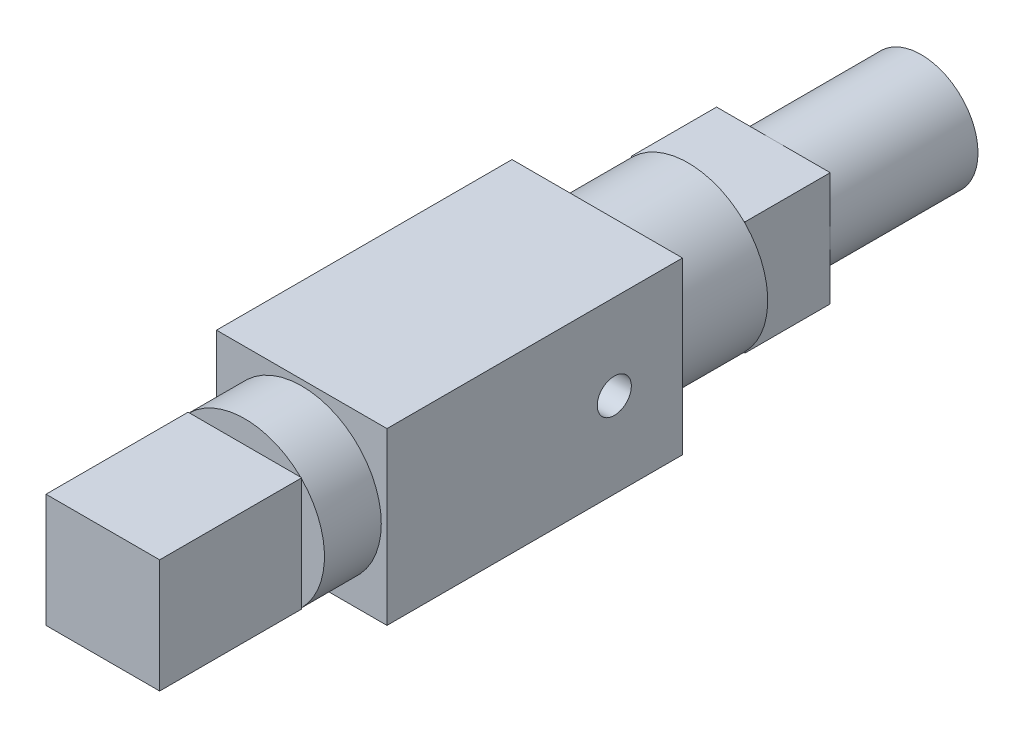
ISO-10303-21;
HEADER;
FILE_DESCRIPTION(('STEP AP214'),'2;1');
FILE_NAME('part.step','',(''),(''),'','','');
FILE_SCHEMA(('AUTOMOTIVE_DESIGN { 1 0 10303 214 1 1 1 1 }'));
ENDSEC;
DATA;
#1=APPLICATION_CONTEXT('core data for automotive mechanical design processes');
#2=APPLICATION_PROTOCOL_DEFINITION('international standard','automotive_design',2000,#1);
#3=PRODUCT_CONTEXT('',#1,'mechanical');
#4=PRODUCT('Part','Part','',(#3));
#5=PRODUCT_RELATED_PRODUCT_CATEGORY('part','',(#4));
#6=PRODUCT_DEFINITION_FORMATION('','',#4);
#7=PRODUCT_DEFINITION_CONTEXT('part definition',#1,'design');
#8=PRODUCT_DEFINITION('design','',#6,#7);
#9=PRODUCT_DEFINITION_SHAPE('','',#8);
#10=(LENGTH_UNIT() NAMED_UNIT(*) SI_UNIT(.MILLI.,.METRE.));
#11=(NAMED_UNIT(*) PLANE_ANGLE_UNIT() SI_UNIT($,.RADIAN.));
#12=(NAMED_UNIT(*) SI_UNIT($,.STERADIAN.) SOLID_ANGLE_UNIT());
#13=UNCERTAINTY_MEASURE_WITH_UNIT(LENGTH_MEASURE(1.E-05),#10,'distance_accuracy_value','');
#14=(GEOMETRIC_REPRESENTATION_CONTEXT(3) GLOBAL_UNCERTAINTY_ASSIGNED_CONTEXT((#13)) GLOBAL_UNIT_ASSIGNED_CONTEXT((#10,
#11,#12)) REPRESENTATION_CONTEXT('',''));
#15=CARTESIAN_POINT('',(0.,0.,0.));
#16=DIRECTION('',(0.,0.,1.));
#17=DIRECTION('',(1.,0.,0.));
#18=AXIS2_PLACEMENT_3D('',#15,#16,#17);
#19=CARTESIAN_POINT('',(0.,0.,59.5));
#20=DIRECTION('',(0.,0.,1.));
#21=DIRECTION('',(1.,0.,0.));
#22=AXIS2_PLACEMENT_3D('',#19,#20,#21);
#23=PLANE('',#22);
#24=DIRECTION('',(0.,-1.,0.));
#25=VECTOR('',#24,1.);
#26=CARTESIAN_POINT('',(-5.,-5.,59.5));
#27=LINE('',#26,#25);
#28=CARTESIAN_POINT('',(-5.,4.89897948556636,59.5));
#29=VERTEX_POINT('',#28);
#30=CARTESIAN_POINT('',(-5.,-4.89897948556636,59.5));
#31=VERTEX_POINT('',#30);
#32=EDGE_CURVE('E11',#29,#31,#27,.T.);
#33=ORIENTED_EDGE('',*,*,#32,.F.);
#34=CARTESIAN_POINT('',(0.,0.,59.5));
#35=DIRECTION('',(0.,0.,1.));
#36=DIRECTION('',(1.,0.,0.));
#37=AXIS2_PLACEMENT_3D('',#34,#35,#36);
#38=CIRCLE('',#37,7.);
#39=EDGE_CURVE('E737',#29,#31,#38,.T.);
#40=ORIENTED_EDGE('',*,*,#39,.T.);
#41=EDGE_LOOP('',(#33,#40));
#42=FACE_BOUND('',#41,.T.);
#43=ADVANCED_FACE('F38',(#42),#23,.T.);
#44=DIRECTION('',(-1.,0.,0.));
#45=VECTOR('',#44,1.);
#46=CARTESIAN_POINT('',(5.,5.,59.5));
#47=LINE('',#46,#45);
#48=CARTESIAN_POINT('',(4.89897948556636,5.,59.5));
#49=VERTEX_POINT('',#48);
#50=CARTESIAN_POINT('',(-4.89897948556636,5.,59.5));
#51=VERTEX_POINT('',#50);
#52=EDGE_CURVE('E47',#49,#51,#47,.T.);
#53=ORIENTED_EDGE('',*,*,#52,.F.);
#54=EDGE_CURVE('E228',#49,#51,#38,.T.);
#55=ORIENTED_EDGE('',*,*,#54,.T.);
#56=EDGE_LOOP('',(#53,#55));
#57=FACE_BOUND('',#56,.T.);
#58=ADVANCED_FACE('F351',(#57),#23,.T.);
#59=DIRECTION('',(0.,1.,0.));
#60=VECTOR('',#59,1.);
#61=CARTESIAN_POINT('',(5.,-5.,59.5));
#62=LINE('',#61,#60);
#63=CARTESIAN_POINT('',(5.,-4.89897948556636,59.5));
#64=VERTEX_POINT('',#63);
#65=CARTESIAN_POINT('',(5.,4.89897948556636,59.5));
#66=VERTEX_POINT('',#65);
#67=EDGE_CURVE('E56',#64,#66,#62,.T.);
#68=ORIENTED_EDGE('',*,*,#67,.F.);
#69=EDGE_CURVE('E217',#64,#66,#38,.T.);
#70=ORIENTED_EDGE('',*,*,#69,.T.);
#71=EDGE_LOOP('',(#68,#70));
#72=FACE_BOUND('',#71,.T.);
#73=ADVANCED_FACE('F358',(#72),#23,.T.);
#74=CARTESIAN_POINT('',(0.,0.,20.5));
#75=DIRECTION('',(0.,0.,1.));
#76=DIRECTION('',(1.,0.,0.));
#77=AXIS2_PLACEMENT_3D('',#74,#75,#76);
#78=PLANE('',#77);
#79=CARTESIAN_POINT('',(0.,0.,20.5));
#80=DIRECTION('',(0.,0.,1.));
#81=DIRECTION('',(1.,0.,0.));
#82=AXIS2_PLACEMENT_3D('',#79,#80,#81);
#83=CIRCLE('',#82,7.);
#84=CARTESIAN_POINT('',(5.,4.89897948556636,20.5));
#85=VERTEX_POINT('',#84);
#86=CARTESIAN_POINT('',(4.89897948556636,5.,20.5));
#87=VERTEX_POINT('',#86);
#88=EDGE_CURVE('E267',#85,#87,#83,.T.);
#89=ORIENTED_EDGE('',*,*,#88,.F.);
#90=DIRECTION('',(0.,1.,0.));
#91=VECTOR('',#90,1.);
#92=CARTESIAN_POINT('',(5.,-5.,20.5));
#93=LINE('',#92,#91);
#94=CARTESIAN_POINT('',(5.,5.,20.5));
#95=VERTEX_POINT('',#94);
#96=EDGE_CURVE('E281',#85,#95,#93,.T.);
#97=ORIENTED_EDGE('',*,*,#96,.T.);
#98=DIRECTION('',(-1.,0.,0.));
#99=VECTOR('',#98,1.);
#100=CARTESIAN_POINT('',(5.,5.,20.5));
#101=LINE('',#100,#99);
#102=EDGE_CURVE('E287',#95,#87,#101,.T.);
#103=ORIENTED_EDGE('',*,*,#102,.T.);
#104=EDGE_LOOP('',(#89,#97,#103));
#105=FACE_BOUND('',#104,.T.);
#106=ADVANCED_FACE('F376',(#105),#78,.T.);
#107=CARTESIAN_POINT('',(-4.89897948556636,5.,20.5));
#108=VERTEX_POINT('',#107);
#109=CARTESIAN_POINT('',(-5.,4.89897948556636,20.5));
#110=VERTEX_POINT('',#109);
#111=EDGE_CURVE('E232',#108,#110,#83,.T.);
#112=ORIENTED_EDGE('',*,*,#111,.F.);
#113=CARTESIAN_POINT('',(-5.,5.,20.5));
#114=VERTEX_POINT('',#113);
#115=EDGE_CURVE('E285',#108,#114,#101,.T.);
#116=ORIENTED_EDGE('',*,*,#115,.T.);
#117=DIRECTION('',(0.,-1.,0.));
#118=VECTOR('',#117,1.);
#119=CARTESIAN_POINT('',(-5.,-5.,20.5));
#120=LINE('',#119,#118);
#121=EDGE_CURVE('E272',#114,#110,#120,.T.);
#122=ORIENTED_EDGE('',*,*,#121,.T.);
#123=EDGE_LOOP('',(#112,#116,#122));
#124=FACE_BOUND('',#123,.T.);
#125=ADVANCED_FACE('F380',(#124),#78,.T.);
#126=CARTESIAN_POINT('',(-5.,-4.89897948556636,20.5));
#127=VERTEX_POINT('',#126);
#128=CARTESIAN_POINT('',(-4.89897948556636,-5.,20.5));
#129=VERTEX_POINT('',#128);
#130=EDGE_CURVE('E326',#127,#129,#83,.T.);
#131=ORIENTED_EDGE('',*,*,#130,.F.);
#132=CARTESIAN_POINT('',(-5.,-5.,20.5));
#133=VERTEX_POINT('',#132);
#134=EDGE_CURVE('E277',#127,#133,#120,.T.);
#135=ORIENTED_EDGE('',*,*,#134,.T.);
#136=DIRECTION('',(1.,0.,0.));
#137=VECTOR('',#136,1.);
#138=CARTESIAN_POINT('',(5.,-5.,20.5));
#139=LINE('',#138,#137);
#140=EDGE_CURVE('E278',#133,#129,#139,.T.);
#141=ORIENTED_EDGE('',*,*,#140,.T.);
#142=EDGE_LOOP('',(#131,#135,#141));
#143=FACE_BOUND('',#142,.T.);
#144=ADVANCED_FACE('F348',(#143),#78,.T.);
#145=CARTESIAN_POINT('',(0.,0.,13.));
#146=DIRECTION('',(0.,0.,-1.));
#147=DIRECTION('',(-1.,0.,0.));
#148=AXIS2_PLACEMENT_3D('',#145,#146,#147);
#149=CYLINDRICAL_SURFACE('',#148,5.);
#150=CARTESIAN_POINT('',(0.,0.,13.));
#151=DIRECTION('',(0.,0.,1.));
#152=DIRECTION('',(1.,0.,0.));
#153=AXIS2_PLACEMENT_3D('',#150,#151,#152);
#154=CIRCLE('',#153,5.);
#155=CARTESIAN_POINT('',(5.,0.,13.));
#156=VERTEX_POINT('',#155);
#157=CARTESIAN_POINT('',(0.,5.,13.));
#158=VERTEX_POINT('',#157);
#159=EDGE_CURVE('E317',#156,#158,#154,.T.);
#160=ORIENTED_EDGE('',*,*,#159,.F.);
#161=CARTESIAN_POINT('',(0.,-5.,13.));
#162=VERTEX_POINT('',#161);
#163=EDGE_CURVE('E320',#162,#156,#154,.T.);
#164=ORIENTED_EDGE('',*,*,#163,.F.);
#165=CARTESIAN_POINT('',(-5.,0.,13.));
#166=VERTEX_POINT('',#165);
#167=EDGE_CURVE('E328',#166,#162,#154,.T.);
#168=ORIENTED_EDGE('',*,*,#167,.F.);
#169=EDGE_CURVE('E319',#158,#166,#154,.T.);
#170=ORIENTED_EDGE('',*,*,#169,.F.);
#171=EDGE_LOOP('',(#160,#164,#168,#170));
#172=FACE_BOUND('',#171,.T.);
#173=CARTESIAN_POINT('',(0.,0.,0.));
#174=DIRECTION('',(0.,0.,1.));
#175=DIRECTION('',(1.,0.,0.));
#176=AXIS2_PLACEMENT_3D('',#173,#174,#175);
#177=CIRCLE('',#176,5.);
#178=CARTESIAN_POINT('',(5.,0.,0.));
#179=VERTEX_POINT('',#178);
#180=EDGE_CURVE('E42',#179,#179,#177,.T.);
#181=ORIENTED_EDGE('',*,*,#180,.T.);
#182=EDGE_LOOP('',(#181));
#183=FACE_BOUND('',#182,.T.);
#184=ADVANCED_FACE('F337',(#172,#183),#149,.T.);
#185=CARTESIAN_POINT('',(0.,0.,8.96538461538461));
#186=DIRECTION('',(0.,0.,1.));
#187=DIRECTION('',(1.,0.,0.));
#188=AXIS2_PLACEMENT_3D('',#185,#186,#187);
#189=SPHERICAL_SURFACE('',#188,10.2653846153846);
#190=ORIENTED_EDGE('',*,*,#180,.F.);
#191=EDGE_LOOP('',(#190));
#192=FACE_BOUND('',#191,.T.);
#193=ADVANCED_FACE('F40',(#192),#189,.T.);
#194=CARTESIAN_POINT('',(0.,0.,13.));
#195=DIRECTION('',(0.,0.,1.));
#196=DIRECTION('',(1.,0.,0.));
#197=AXIS2_PLACEMENT_3D('',#194,#195,#196);
#198=PLANE('',#197);
#199=DIRECTION('',(0.,1.,0.));
#200=VECTOR('',#199,1.);
#201=CARTESIAN_POINT('',(5.,-5.,13.));
#202=LINE('',#201,#200);
#203=CARTESIAN_POINT('',(5.,5.,13.));
#204=VERTEX_POINT('',#203);
#205=EDGE_CURVE('E299',#156,#204,#202,.T.);
#206=ORIENTED_EDGE('',*,*,#205,.F.);
#207=ORIENTED_EDGE('',*,*,#159,.T.);
#208=DIRECTION('',(-1.,0.,0.));
#209=VECTOR('',#208,1.);
#210=CARTESIAN_POINT('',(5.,5.,13.));
#211=LINE('',#210,#209);
#212=EDGE_CURVE('E304',#204,#158,#211,.T.);
#213=ORIENTED_EDGE('',*,*,#212,.F.);
#214=EDGE_LOOP('',(#206,#207,#213));
#215=FACE_BOUND('',#214,.T.);
#216=ADVANCED_FACE('F340',(#215),#198,.F.);
#217=CARTESIAN_POINT('',(-5.,5.,13.));
#218=VERTEX_POINT('',#217);
#219=EDGE_CURVE('E303',#158,#218,#211,.T.);
#220=ORIENTED_EDGE('',*,*,#219,.F.);
#221=ORIENTED_EDGE('',*,*,#169,.T.);
#222=DIRECTION('',(0.,-1.,0.));
#223=VECTOR('',#222,1.);
#224=CARTESIAN_POINT('',(-5.,-5.,13.));
#225=LINE('',#224,#223);
#226=EDGE_CURVE('E292',#218,#166,#225,.T.);
#227=ORIENTED_EDGE('',*,*,#226,.F.);
#228=EDGE_LOOP('',(#220,#221,#227));
#229=FACE_BOUND('',#228,.T.);
#230=ADVANCED_FACE('F345',(#229),#198,.F.);
#231=CARTESIAN_POINT('',(-5.,-5.,13.));
#232=VERTEX_POINT('',#231);
#233=EDGE_CURVE('E266',#166,#232,#225,.T.);
#234=ORIENTED_EDGE('',*,*,#233,.F.);
#235=ORIENTED_EDGE('',*,*,#167,.T.);
#236=DIRECTION('',(1.,0.,0.));
#237=VECTOR('',#236,1.);
#238=CARTESIAN_POINT('',(5.,-5.,13.));
#239=LINE('',#238,#237);
#240=EDGE_CURVE('E296',#232,#162,#239,.T.);
#241=ORIENTED_EDGE('',*,*,#240,.F.);
#242=EDGE_LOOP('',(#234,#235,#241));
#243=FACE_BOUND('',#242,.T.);
#244=ADVANCED_FACE('F447',(#243),#198,.F.);
#245=CARTESIAN_POINT('',(5.,-5.,13.));
#246=VERTEX_POINT('',#245);
#247=EDGE_CURVE('E295',#162,#246,#239,.T.);
#248=ORIENTED_EDGE('',*,*,#247,.F.);
#249=ORIENTED_EDGE('',*,*,#163,.T.);
#250=EDGE_CURVE('E300',#246,#156,#202,.T.);
#251=ORIENTED_EDGE('',*,*,#250,.F.);
#252=EDGE_LOOP('',(#248,#249,#251));
#253=FACE_BOUND('',#252,.T.);
#254=ADVANCED_FACE('F347',(#253),#198,.F.);
#255=CARTESIAN_POINT('',(-5.,-5.,20.5));
#256=DIRECTION('',(1.,0.,0.));
#257=DIRECTION('',(0.,0.,-1.));
#258=AXIS2_PLACEMENT_3D('',#255,#256,#257);
#259=PLANE('',#258);
#260=ORIENTED_EDGE('',*,*,#226,.T.);
#261=ORIENTED_EDGE('',*,*,#233,.T.);
#262=DIRECTION('',(0.,0.,-1.));
#263=VECTOR('',#262,1.);
#264=CARTESIAN_POINT('',(-5.,-5.,20.5));
#265=LINE('',#264,#263);
#266=EDGE_CURVE('E315',#133,#232,#265,.T.);
#267=ORIENTED_EDGE('',*,*,#266,.F.);
#268=ORIENTED_EDGE('',*,*,#134,.F.);
#269=EDGE_CURVE('E276',#110,#127,#120,.T.);
#270=ORIENTED_EDGE('',*,*,#269,.F.);
#271=ORIENTED_EDGE('',*,*,#121,.F.);
#272=DIRECTION('',(0.,0.,-1.));
#273=VECTOR('',#272,1.);
#274=CARTESIAN_POINT('',(-5.,5.,20.5));
#275=LINE('',#274,#273);
#276=EDGE_CURVE('E290',#114,#218,#275,.T.);
#277=ORIENTED_EDGE('',*,*,#276,.T.);
#278=EDGE_LOOP('',(#260,#261,#267,#268,#270,#271,#277));
#279=FACE_BOUND('',#278,.T.);
#280=ADVANCED_FACE('F418',(#279),#259,.F.);
#281=CARTESIAN_POINT('',(5.,-5.,20.5));
#282=DIRECTION('',(0.,1.,0.));
#283=DIRECTION('',(-1.,0.,0.));
#284=AXIS2_PLACEMENT_3D('',#281,#282,#283);
#285=PLANE('',#284);
#286=ORIENTED_EDGE('',*,*,#240,.T.);
#287=ORIENTED_EDGE('',*,*,#247,.T.);
#288=DIRECTION('',(0.,0.,-1.));
#289=VECTOR('',#288,1.);
#290=CARTESIAN_POINT('',(5.,-5.,20.5));
#291=LINE('',#290,#289);
#292=CARTESIAN_POINT('',(5.,-5.,20.5));
#293=VERTEX_POINT('',#292);
#294=EDGE_CURVE('E312',#293,#246,#291,.T.);
#295=ORIENTED_EDGE('',*,*,#294,.F.);
#296=CARTESIAN_POINT('',(4.89897948556636,-5.,20.5));
#297=VERTEX_POINT('',#296);
#298=EDGE_CURVE('E275',#297,#293,#139,.T.);
#299=ORIENTED_EDGE('',*,*,#298,.F.);
#300=EDGE_CURVE('E282',#129,#297,#139,.T.);
#301=ORIENTED_EDGE('',*,*,#300,.F.);
#302=ORIENTED_EDGE('',*,*,#140,.F.);
#303=ORIENTED_EDGE('',*,*,#266,.T.);
#304=EDGE_LOOP('',(#286,#287,#295,#299,#301,#302,#303));
#305=FACE_BOUND('',#304,.T.);
#306=ADVANCED_FACE('F449',(#305),#285,.F.);
#307=CARTESIAN_POINT('',(5.,-5.,20.5));
#308=DIRECTION('',(-1.,0.,0.));
#309=DIRECTION('',(0.,0.,1.));
#310=AXIS2_PLACEMENT_3D('',#307,#308,#309);
#311=PLANE('',#310);
#312=ORIENTED_EDGE('',*,*,#250,.T.);
#313=ORIENTED_EDGE('',*,*,#205,.T.);
#314=DIRECTION('',(0.,0.,-1.));
#315=VECTOR('',#314,1.);
#316=CARTESIAN_POINT('',(5.,5.,20.5));
#317=LINE('',#316,#315);
#318=EDGE_CURVE('E309',#95,#204,#317,.T.);
#319=ORIENTED_EDGE('',*,*,#318,.F.);
#320=ORIENTED_EDGE('',*,*,#96,.F.);
#321=CARTESIAN_POINT('',(5.,-4.89897948556636,20.5));
#322=VERTEX_POINT('',#321);
#323=EDGE_CURVE('E286',#322,#85,#93,.T.);
#324=ORIENTED_EDGE('',*,*,#323,.F.);
#325=EDGE_CURVE('E283',#293,#322,#93,.T.);
#326=ORIENTED_EDGE('',*,*,#325,.F.);
#327=ORIENTED_EDGE('',*,*,#294,.T.);
#328=EDGE_LOOP('',(#312,#313,#319,#320,#324,#326,#327));
#329=FACE_BOUND('',#328,.T.);
#330=ADVANCED_FACE('F401',(#329),#311,.F.);
#331=CARTESIAN_POINT('',(5.,5.,20.5));
#332=DIRECTION('',(0.,-1.,0.));
#333=DIRECTION('',(1.,0.,0.));
#334=AXIS2_PLACEMENT_3D('',#331,#332,#333);
#335=PLANE('',#334);
#336=ORIENTED_EDGE('',*,*,#212,.T.);
#337=ORIENTED_EDGE('',*,*,#219,.T.);
#338=ORIENTED_EDGE('',*,*,#276,.F.);
#339=ORIENTED_EDGE('',*,*,#115,.F.);
#340=EDGE_CURVE('E291',#87,#108,#101,.T.);
#341=ORIENTED_EDGE('',*,*,#340,.F.);
#342=ORIENTED_EDGE('',*,*,#102,.F.);
#343=ORIENTED_EDGE('',*,*,#318,.T.);
#344=EDGE_LOOP('',(#336,#337,#338,#339,#341,#342,#343));
#345=FACE_BOUND('',#344,.T.);
#346=ADVANCED_FACE('F391',(#345),#335,.F.);
#347=EDGE_CURVE('E271',#297,#322,#83,.T.);
#348=ORIENTED_EDGE('',*,*,#347,.F.);
#349=ORIENTED_EDGE('',*,*,#298,.T.);
#350=ORIENTED_EDGE('',*,*,#325,.T.);
#351=EDGE_LOOP('',(#348,#349,#350));
#352=FACE_BOUND('',#351,.T.);
#353=ADVANCED_FACE('F383',(#352),#78,.T.);
#354=CARTESIAN_POINT('',(0.,0.,20.5));
#355=DIRECTION('',(0.,0.,1.));
#356=DIRECTION('',(1.,0.,0.));
#357=AXIS2_PLACEMENT_3D('',#354,#355,#356);
#358=PLANE('',#357);
#359=EDGE_CURVE('E421',#110,#127,#83,.T.);
#360=ORIENTED_EDGE('',*,*,#359,.F.);
#361=ORIENTED_EDGE('',*,*,#269,.T.);
#362=EDGE_LOOP('',(#360,#361));
#363=FACE_BOUND('',#362,.T.);
#364=ADVANCED_FACE('F390',(#363),#358,.F.);
#365=EDGE_CURVE('E425',#129,#297,#83,.T.);
#366=ORIENTED_EDGE('',*,*,#365,.F.);
#367=ORIENTED_EDGE('',*,*,#300,.T.);
#368=EDGE_LOOP('',(#366,#367));
#369=FACE_BOUND('',#368,.T.);
#370=ADVANCED_FACE('F397',(#369),#358,.F.);
#371=EDGE_CURVE('E262',#322,#85,#83,.T.);
#372=ORIENTED_EDGE('',*,*,#371,.F.);
#373=ORIENTED_EDGE('',*,*,#323,.T.);
#374=EDGE_LOOP('',(#372,#373));
#375=FACE_BOUND('',#374,.T.);
#376=ADVANCED_FACE('F430',(#375),#358,.F.);
#377=EDGE_CURVE('E270',#87,#108,#83,.T.);
#378=ORIENTED_EDGE('',*,*,#377,.F.);
#379=ORIENTED_EDGE('',*,*,#340,.T.);
#380=EDGE_LOOP('',(#378,#379));
#381=FACE_BOUND('',#380,.T.);
#382=ADVANCED_FACE('F400',(#381),#358,.F.);
#383=CARTESIAN_POINT('',(0.,0.,28.5));
#384=DIRECTION('',(0.,0.,-1.));
#385=DIRECTION('',(-1.,0.,0.));
#386=AXIS2_PLACEMENT_3D('',#383,#384,#385);
#387=CYLINDRICAL_SURFACE('',#386,7.);
#388=CARTESIAN_POINT('',(0.,0.,28.5));
#389=DIRECTION('',(0.,0.,1.));
#390=DIRECTION('',(1.,0.,0.));
#391=AXIS2_PLACEMENT_3D('',#388,#389,#390);
#392=CIRCLE('',#391,7.);
#393=CARTESIAN_POINT('',(7.,0.,28.5));
#394=VERTEX_POINT('',#393);
#395=EDGE_CURVE('E263',#394,#394,#392,.T.);
#396=ORIENTED_EDGE('',*,*,#395,.F.);
#397=EDGE_LOOP('',(#396));
#398=FACE_BOUND('',#397,.T.);
#399=ORIENTED_EDGE('',*,*,#88,.T.);
#400=ORIENTED_EDGE('',*,*,#377,.T.);
#401=ORIENTED_EDGE('',*,*,#111,.T.);
#402=ORIENTED_EDGE('',*,*,#359,.T.);
#403=ORIENTED_EDGE('',*,*,#130,.T.);
#404=ORIENTED_EDGE('',*,*,#365,.T.);
#405=ORIENTED_EDGE('',*,*,#347,.T.);
#406=ORIENTED_EDGE('',*,*,#371,.T.);
#407=EDGE_LOOP('',(#399,#400,#401,#402,#403,#404,#405,#406));
#408=FACE_BOUND('',#407,.T.);
#409=ADVANCED_FACE('F423',(#398,#408),#387,.T.);
#410=CARTESIAN_POINT('',(-7.5,-7.5,54.5));
#411=DIRECTION('',(1.,0.,0.));
#412=DIRECTION('',(0.,0.,-1.));
#413=AXIS2_PLACEMENT_3D('',#410,#411,#412);
#414=PLANE('',#413);
#415=CARTESIAN_POINT('',(-7.5,0.,34.5));
#416=DIRECTION('',(-1.,0.,0.));
#417=DIRECTION('',(0.,0.,1.));
#418=AXIS2_PLACEMENT_3D('',#415,#416,#417);
#419=CIRCLE('',#418,1.5);
#420=CARTESIAN_POINT('',(-7.5,0.,36.));
#421=VERTEX_POINT('',#420);
#422=EDGE_CURVE('E705',#421,#421,#419,.T.);
#423=ORIENTED_EDGE('',*,*,#422,.F.);
#424=EDGE_LOOP('',(#423));
#425=FACE_BOUND('',#424,.T.);
#426=DIRECTION('',(0.,-1.,0.));
#427=VECTOR('',#426,1.);
#428=CARTESIAN_POINT('',(-7.5,-7.5,28.5));
#429=LINE('',#428,#427);
#430=CARTESIAN_POINT('',(-7.5,7.5,28.5));
#431=VERTEX_POINT('',#430);
#432=CARTESIAN_POINT('',(-7.5,-7.5,28.5));
#433=VERTEX_POINT('',#432);
#434=EDGE_CURVE('E227',#431,#433,#429,.T.);
#435=ORIENTED_EDGE('',*,*,#434,.T.);
#436=DIRECTION('',(0.,0.,-1.));
#437=VECTOR('',#436,1.);
#438=CARTESIAN_POINT('',(-7.5,-7.5,54.5));
#439=LINE('',#438,#437);
#440=CARTESIAN_POINT('',(-7.5,-7.5,54.5));
#441=VERTEX_POINT('',#440);
#442=EDGE_CURVE('E259',#441,#433,#439,.T.);
#443=ORIENTED_EDGE('',*,*,#442,.F.);
#444=DIRECTION('',(0.,-1.,0.));
#445=VECTOR('',#444,1.);
#446=CARTESIAN_POINT('',(-7.5,-7.5,54.5));
#447=LINE('',#446,#445);
#448=CARTESIAN_POINT('',(-7.5,7.5,54.5));
#449=VERTEX_POINT('',#448);
#450=EDGE_CURVE('E233',#449,#441,#447,.T.);
#451=ORIENTED_EDGE('',*,*,#450,.F.);
#452=DIRECTION('',(0.,0.,-1.));
#453=VECTOR('',#452,1.);
#454=CARTESIAN_POINT('',(-7.5,7.5,54.5));
#455=LINE('',#454,#453);
#456=EDGE_CURVE('E243',#449,#431,#455,.T.);
#457=ORIENTED_EDGE('',*,*,#456,.T.);
#458=EDGE_LOOP('',(#435,#443,#451,#457));
#459=FACE_BOUND('',#458,.T.);
#460=ADVANCED_FACE('F518',(#425,#459),#414,.F.);
#461=CARTESIAN_POINT('',(7.5,-7.5,54.5));
#462=DIRECTION('',(0.,1.,0.));
#463=DIRECTION('',(-1.,0.,0.));
#464=AXIS2_PLACEMENT_3D('',#461,#462,#463);
#465=PLANE('',#464);
#466=DIRECTION('',(1.,0.,0.));
#467=VECTOR('',#466,1.);
#468=CARTESIAN_POINT('',(7.5,-7.5,28.5));
#469=LINE('',#468,#467);
#470=CARTESIAN_POINT('',(7.5,-7.5,28.5));
#471=VERTEX_POINT('',#470);
#472=EDGE_CURVE('E246',#433,#471,#469,.T.);
#473=ORIENTED_EDGE('',*,*,#472,.T.);
#474=DIRECTION('',(0.,0.,-1.));
#475=VECTOR('',#474,1.);
#476=CARTESIAN_POINT('',(7.5,-7.5,54.5));
#477=LINE('',#476,#475);
#478=CARTESIAN_POINT('',(7.5,-7.5,54.5));
#479=VERTEX_POINT('',#478);
#480=EDGE_CURVE('E256',#479,#471,#477,.T.);
#481=ORIENTED_EDGE('',*,*,#480,.F.);
#482=DIRECTION('',(1.,0.,0.));
#483=VECTOR('',#482,1.);
#484=CARTESIAN_POINT('',(7.5,-7.5,54.5));
#485=LINE('',#484,#483);
#486=EDGE_CURVE('E236',#441,#479,#485,.T.);
#487=ORIENTED_EDGE('',*,*,#486,.F.);
#488=ORIENTED_EDGE('',*,*,#442,.T.);
#489=EDGE_LOOP('',(#473,#481,#487,#488));
#490=FACE_BOUND('',#489,.T.);
#491=ADVANCED_FACE('F525',(#490),#465,.F.);
#492=CARTESIAN_POINT('',(7.5,-7.5,54.5));
#493=DIRECTION('',(-1.,0.,0.));
#494=DIRECTION('',(0.,-1.,0.));
#495=AXIS2_PLACEMENT_3D('',#492,#493,#494);
#496=PLANE('',#495);
#497=CARTESIAN_POINT('',(7.5,0.,34.5));
#498=DIRECTION('',(-1.,0.,0.));
#499=DIRECTION('',(0.,0.,1.));
#500=AXIS2_PLACEMENT_3D('',#497,#498,#499);
#501=CIRCLE('',#500,1.5);
#502=CARTESIAN_POINT('',(7.5,0.,36.));
#503=VERTEX_POINT('',#502);
#504=EDGE_CURVE('E702',#503,#503,#501,.T.);
#505=ORIENTED_EDGE('',*,*,#504,.T.);
#506=EDGE_LOOP('',(#505));
#507=FACE_BOUND('',#506,.T.);
#508=DIRECTION('',(0.,1.,0.));
#509=VECTOR('',#508,1.);
#510=CARTESIAN_POINT('',(7.5,-7.5,28.5));
#511=LINE('',#510,#509);
#512=CARTESIAN_POINT('',(7.5,7.5,28.5));
#513=VERTEX_POINT('',#512);
#514=EDGE_CURVE('E248',#471,#513,#511,.T.);
#515=ORIENTED_EDGE('',*,*,#514,.T.);
#516=DIRECTION('',(0.,0.,-1.));
#517=VECTOR('',#516,1.);
#518=CARTESIAN_POINT('',(7.5,7.5,54.5));
#519=LINE('',#518,#517);
#520=CARTESIAN_POINT('',(7.5,7.5,54.5));
#521=VERTEX_POINT('',#520);
#522=EDGE_CURVE('E253',#521,#513,#519,.T.);
#523=ORIENTED_EDGE('',*,*,#522,.F.);
#524=DIRECTION('',(0.,1.,0.));
#525=VECTOR('',#524,1.);
#526=CARTESIAN_POINT('',(7.5,-7.5,54.5));
#527=LINE('',#526,#525);
#528=EDGE_CURVE('E239',#479,#521,#527,.T.);
#529=ORIENTED_EDGE('',*,*,#528,.F.);
#530=ORIENTED_EDGE('',*,*,#480,.T.);
#531=EDGE_LOOP('',(#515,#523,#529,#530));
#532=FACE_BOUND('',#531,.T.);
#533=ADVANCED_FACE('F530',(#507,#532),#496,.F.);
#534=CARTESIAN_POINT('',(7.5,7.5,54.5));
#535=DIRECTION('',(0.,-1.,0.));
#536=DIRECTION('',(1.,0.,0.));
#537=AXIS2_PLACEMENT_3D('',#534,#535,#536);
#538=PLANE('',#537);
#539=DIRECTION('',(-1.,0.,0.));
#540=VECTOR('',#539,1.);
#541=CARTESIAN_POINT('',(7.5,7.5,28.5));
#542=LINE('',#541,#540);
#543=EDGE_CURVE('E237',#513,#431,#542,.T.);
#544=ORIENTED_EDGE('',*,*,#543,.T.);
#545=ORIENTED_EDGE('',*,*,#456,.F.);
#546=DIRECTION('',(-1.,0.,0.));
#547=VECTOR('',#546,1.);
#548=CARTESIAN_POINT('',(7.5,7.5,54.5));
#549=LINE('',#548,#547);
#550=EDGE_CURVE('E241',#521,#449,#549,.T.);
#551=ORIENTED_EDGE('',*,*,#550,.F.);
#552=ORIENTED_EDGE('',*,*,#522,.T.);
#553=EDGE_LOOP('',(#544,#545,#551,#552));
#554=FACE_BOUND('',#553,.T.);
#555=ADVANCED_FACE('F538',(#554),#538,.F.);
#556=CARTESIAN_POINT('',(0.,0.,54.5));
#557=DIRECTION('',(0.,0.,1.));
#558=DIRECTION('',(1.,0.,0.));
#559=AXIS2_PLACEMENT_3D('',#556,#557,#558);
#560=PLANE('',#559);
#561=CARTESIAN_POINT('',(0.,0.,54.5));
#562=DIRECTION('',(0.,0.,1.));
#563=DIRECTION('',(1.,0.,0.));
#564=AXIS2_PLACEMENT_3D('',#561,#562,#563);
#565=CIRCLE('',#564,7.);
#566=CARTESIAN_POINT('',(7.,0.,54.5));
#567=VERTEX_POINT('',#566);
#568=EDGE_CURVE('E229',#567,#567,#565,.T.);
#569=ORIENTED_EDGE('',*,*,#568,.F.);
#570=EDGE_LOOP('',(#569));
#571=FACE_BOUND('',#570,.T.);
#572=ORIENTED_EDGE('',*,*,#450,.T.);
#573=ORIENTED_EDGE('',*,*,#486,.T.);
#574=ORIENTED_EDGE('',*,*,#528,.T.);
#575=ORIENTED_EDGE('',*,*,#550,.T.);
#576=EDGE_LOOP('',(#572,#573,#574,#575));
#577=FACE_BOUND('',#576,.T.);
#578=ADVANCED_FACE('F543',(#571,#577),#560,.T.);
#579=CARTESIAN_POINT('',(0.,0.,28.5));
#580=DIRECTION('',(0.,0.,1.));
#581=DIRECTION('',(1.,0.,0.));
#582=AXIS2_PLACEMENT_3D('',#579,#580,#581);
#583=PLANE('',#582);
#584=ORIENTED_EDGE('',*,*,#395,.T.);
#585=EDGE_LOOP('',(#584));
#586=FACE_BOUND('',#585,.T.);
#587=ORIENTED_EDGE('',*,*,#434,.F.);
#588=ORIENTED_EDGE('',*,*,#543,.F.);
#589=ORIENTED_EDGE('',*,*,#514,.F.);
#590=ORIENTED_EDGE('',*,*,#472,.F.);
#591=EDGE_LOOP('',(#587,#588,#589,#590));
#592=FACE_BOUND('',#591,.T.);
#593=ADVANCED_FACE('F373',(#586,#592),#583,.F.);
#594=CARTESIAN_POINT('',(0.,0.,59.5));
#595=DIRECTION('',(0.,0.,-1.));
#596=DIRECTION('',(-1.,0.,0.));
#597=AXIS2_PLACEMENT_3D('',#594,#595,#596);
#598=CYLINDRICAL_SURFACE('',#597,7.);
#599=EDGE_CURVE('E221',#66,#49,#38,.T.);
#600=ORIENTED_EDGE('',*,*,#599,.F.);
#601=ORIENTED_EDGE('',*,*,#69,.F.);
#602=CARTESIAN_POINT('',(4.89897948556636,-5.,59.5));
#603=VERTEX_POINT('',#602);
#604=EDGE_CURVE('E219',#603,#64,#38,.T.);
#605=ORIENTED_EDGE('',*,*,#604,.F.);
#606=CARTESIAN_POINT('',(-4.89897948556635,-5.,59.5));
#607=VERTEX_POINT('',#606);
#608=EDGE_CURVE('E742',#607,#603,#38,.T.);
#609=ORIENTED_EDGE('',*,*,#608,.F.);
#610=EDGE_CURVE('E740',#31,#607,#38,.T.);
#611=ORIENTED_EDGE('',*,*,#610,.F.);
#612=ORIENTED_EDGE('',*,*,#39,.F.);
#613=EDGE_CURVE('E735',#51,#29,#38,.T.);
#614=ORIENTED_EDGE('',*,*,#613,.F.);
#615=ORIENTED_EDGE('',*,*,#54,.F.);
#616=EDGE_LOOP('',(#600,#601,#605,#609,#611,#612,#614,#615));
#617=FACE_BOUND('',#616,.T.);
#618=ORIENTED_EDGE('',*,*,#568,.T.);
#619=EDGE_LOOP('',(#618));
#620=FACE_BOUND('',#619,.T.);
#621=ADVANCED_FACE('F364',(#617,#620),#598,.T.);
#622=DIRECTION('',(1.,0.,0.));
#623=VECTOR('',#622,1.);
#624=CARTESIAN_POINT('',(5.,-5.,59.5));
#625=LINE('',#624,#623);
#626=EDGE_CURVE('E63',#607,#603,#625,.T.);
#627=ORIENTED_EDGE('',*,*,#626,.F.);
#628=ORIENTED_EDGE('',*,*,#608,.T.);
#629=EDGE_LOOP('',(#627,#628));
#630=FACE_BOUND('',#629,.T.);
#631=ADVANCED_FACE('F354',(#630),#23,.T.);
#632=CARTESIAN_POINT('',(0.,0.,59.5));
#633=DIRECTION('',(0.,0.,1.));
#634=DIRECTION('',(1.,0.,0.));
#635=AXIS2_PLACEMENT_3D('',#632,#633,#634);
#636=PLANE('',#635);
#637=CARTESIAN_POINT('',(5.,5.,59.5));
#638=VERTEX_POINT('',#637);
#639=EDGE_CURVE('E715',#66,#638,#62,.T.);
#640=ORIENTED_EDGE('',*,*,#639,.F.);
#641=ORIENTED_EDGE('',*,*,#599,.T.);
#642=EDGE_CURVE('E211',#638,#49,#47,.T.);
#643=ORIENTED_EDGE('',*,*,#642,.F.);
#644=EDGE_LOOP('',(#640,#641,#643));
#645=FACE_BOUND('',#644,.T.);
#646=ADVANCED_FACE('F363',(#645),#636,.F.);
#647=CARTESIAN_POINT('',(-5.,5.,59.5));
#648=VERTEX_POINT('',#647);
#649=EDGE_CURVE('E719',#51,#648,#47,.T.);
#650=ORIENTED_EDGE('',*,*,#649,.F.);
#651=ORIENTED_EDGE('',*,*,#613,.T.);
#652=EDGE_CURVE('E49',#648,#29,#27,.T.);
#653=ORIENTED_EDGE('',*,*,#652,.F.);
#654=EDGE_LOOP('',(#650,#651,#653));
#655=FACE_BOUND('',#654,.T.);
#656=ADVANCED_FACE('F369',(#655),#636,.F.);
#657=CARTESIAN_POINT('',(-5.,-5.,59.5));
#658=VERTEX_POINT('',#657);
#659=EDGE_CURVE('E50',#31,#658,#27,.T.);
#660=ORIENTED_EDGE('',*,*,#659,.F.);
#661=ORIENTED_EDGE('',*,*,#610,.T.);
#662=EDGE_CURVE('E713',#658,#607,#625,.T.);
#663=ORIENTED_EDGE('',*,*,#662,.F.);
#664=EDGE_LOOP('',(#660,#661,#663));
#665=FACE_BOUND('',#664,.T.);
#666=ADVANCED_FACE('F601',(#665),#636,.F.);
#667=CARTESIAN_POINT('',(5.,-5.,59.5));
#668=VERTEX_POINT('',#667);
#669=EDGE_CURVE('E712',#603,#668,#625,.T.);
#670=ORIENTED_EDGE('',*,*,#669,.F.);
#671=ORIENTED_EDGE('',*,*,#604,.T.);
#672=EDGE_CURVE('E716',#668,#64,#62,.T.);
#673=ORIENTED_EDGE('',*,*,#672,.F.);
#674=EDGE_LOOP('',(#670,#671,#673));
#675=FACE_BOUND('',#674,.T.);
#676=ADVANCED_FACE('F372',(#675),#636,.F.);
#677=CARTESIAN_POINT('',(-5.,-5.,72.));
#678=DIRECTION('',(1.,0.,0.));
#679=DIRECTION('',(0.,0.,-1.));
#680=AXIS2_PLACEMENT_3D('',#677,#678,#679);
#681=PLANE('',#680);
#682=ORIENTED_EDGE('',*,*,#652,.T.);
#683=ORIENTED_EDGE('',*,*,#32,.T.);
#684=ORIENTED_EDGE('',*,*,#659,.T.);
#685=DIRECTION('',(0.,0.,-1.));
#686=VECTOR('',#685,1.);
#687=CARTESIAN_POINT('',(-5.,-5.,72.));
#688=LINE('',#687,#686);
#689=CARTESIAN_POINT('',(-5.,-5.,72.));
#690=VERTEX_POINT('',#689);
#691=EDGE_CURVE('E196',#690,#658,#688,.T.);
#692=ORIENTED_EDGE('',*,*,#691,.F.);
#693=DIRECTION('',(0.,-1.,0.));
#694=VECTOR('',#693,1.);
#695=CARTESIAN_POINT('',(-5.,-5.,72.));
#696=LINE('',#695,#694);
#697=CARTESIAN_POINT('',(-5.,5.,72.));
#698=VERTEX_POINT('',#697);
#699=EDGE_CURVE('E202',#698,#690,#696,.T.);
#700=ORIENTED_EDGE('',*,*,#699,.F.);
#701=DIRECTION('',(0.,0.,-1.));
#702=VECTOR('',#701,1.);
#703=CARTESIAN_POINT('',(-5.,5.,72.));
#704=LINE('',#703,#702);
#705=EDGE_CURVE('E710',#698,#648,#704,.T.);
#706=ORIENTED_EDGE('',*,*,#705,.T.);
#707=EDGE_LOOP('',(#682,#683,#684,#692,#700,#706));
#708=FACE_BOUND('',#707,.T.);
#709=ADVANCED_FACE('F214',(#708),#681,.F.);
#710=CARTESIAN_POINT('',(5.,-5.,72.));
#711=DIRECTION('',(0.,1.,0.));
#712=DIRECTION('',(-1.,0.,0.));
#713=AXIS2_PLACEMENT_3D('',#710,#711,#712);
#714=PLANE('',#713);
#715=ORIENTED_EDGE('',*,*,#662,.T.);
#716=ORIENTED_EDGE('',*,*,#626,.T.);
#717=ORIENTED_EDGE('',*,*,#669,.T.);
#718=DIRECTION('',(0.,0.,-1.));
#719=VECTOR('',#718,1.);
#720=CARTESIAN_POINT('',(5.,-5.,72.));
#721=LINE('',#720,#719);
#722=CARTESIAN_POINT('',(5.,-5.,72.));
#723=VERTEX_POINT('',#722);
#724=EDGE_CURVE('E198',#723,#668,#721,.T.);
#725=ORIENTED_EDGE('',*,*,#724,.F.);
#726=DIRECTION('',(1.,0.,0.));
#727=VECTOR('',#726,1.);
#728=CARTESIAN_POINT('',(5.,-5.,72.));
#729=LINE('',#728,#727);
#730=EDGE_CURVE('E191',#690,#723,#729,.T.);
#731=ORIENTED_EDGE('',*,*,#730,.F.);
#732=ORIENTED_EDGE('',*,*,#691,.T.);
#733=EDGE_LOOP('',(#715,#716,#717,#725,#731,#732));
#734=FACE_BOUND('',#733,.T.);
#735=ADVANCED_FACE('F194',(#734),#714,.F.);
#736=CARTESIAN_POINT('',(5.,-5.,72.));
#737=DIRECTION('',(-1.,0.,0.));
#738=DIRECTION('',(0.,0.,1.));
#739=AXIS2_PLACEMENT_3D('',#736,#737,#738);
#740=PLANE('',#739);
#741=ORIENTED_EDGE('',*,*,#672,.T.);
#742=ORIENTED_EDGE('',*,*,#67,.T.);
#743=ORIENTED_EDGE('',*,*,#639,.T.);
#744=DIRECTION('',(0.,0.,-1.));
#745=VECTOR('',#744,1.);
#746=CARTESIAN_POINT('',(5.,5.,72.));
#747=LINE('',#746,#745);
#748=CARTESIAN_POINT('',(5.,5.,72.));
#749=VERTEX_POINT('',#748);
#750=EDGE_CURVE('E222',#749,#638,#747,.T.);
#751=ORIENTED_EDGE('',*,*,#750,.F.);
#752=DIRECTION('',(0.,1.,0.));
#753=VECTOR('',#752,1.);
#754=CARTESIAN_POINT('',(5.,-5.,72.));
#755=LINE('',#754,#753);
#756=EDGE_CURVE('E201',#723,#749,#755,.T.);
#757=ORIENTED_EDGE('',*,*,#756,.F.);
#758=ORIENTED_EDGE('',*,*,#724,.T.);
#759=EDGE_LOOP('',(#741,#742,#743,#751,#757,#758));
#760=FACE_BOUND('',#759,.T.);
#761=ADVANCED_FACE('F633',(#760),#740,.F.);
#762=CARTESIAN_POINT('',(5.,5.,72.));
#763=DIRECTION('',(0.,-1.,0.));
#764=DIRECTION('',(0.,0.,-1.));
#765=AXIS2_PLACEMENT_3D('',#762,#763,#764);
#766=PLANE('',#765);
#767=ORIENTED_EDGE('',*,*,#642,.T.);
#768=ORIENTED_EDGE('',*,*,#52,.T.);
#769=ORIENTED_EDGE('',*,*,#649,.T.);
#770=ORIENTED_EDGE('',*,*,#705,.F.);
#771=DIRECTION('',(-1.,0.,0.));
#772=VECTOR('',#771,1.);
#773=CARTESIAN_POINT('',(5.,5.,72.));
#774=LINE('',#773,#772);
#775=EDGE_CURVE('E207',#749,#698,#774,.T.);
#776=ORIENTED_EDGE('',*,*,#775,.F.);
#777=ORIENTED_EDGE('',*,*,#750,.T.);
#778=EDGE_LOOP('',(#767,#768,#769,#770,#776,#777));
#779=FACE_BOUND('',#778,.T.);
#780=ADVANCED_FACE('F642',(#779),#766,.F.);
#781=CARTESIAN_POINT('',(0.,0.,72.));
#782=DIRECTION('',(0.,0.,1.));
#783=DIRECTION('',(1.,0.,0.));
#784=AXIS2_PLACEMENT_3D('',#781,#782,#783);
#785=PLANE('',#784);
#786=ORIENTED_EDGE('',*,*,#699,.T.);
#787=ORIENTED_EDGE('',*,*,#730,.T.);
#788=ORIENTED_EDGE('',*,*,#756,.T.);
#789=ORIENTED_EDGE('',*,*,#775,.T.);
#790=EDGE_LOOP('',(#786,#787,#788,#789));
#791=FACE_BOUND('',#790,.T.);
#792=ADVANCED_FACE('F205',(#791),#785,.T.);
#793=CARTESIAN_POINT('',(7.5,0.,34.5));
#794=DIRECTION('',(-1.,0.,0.));
#795=DIRECTION('',(0.,0.,1.));
#796=AXIS2_PLACEMENT_3D('',#793,#794,#795);
#797=CYLINDRICAL_SURFACE('',#796,1.5);
#798=ORIENTED_EDGE('',*,*,#504,.F.);
#799=EDGE_LOOP('',(#798));
#800=FACE_BOUND('',#799,.T.);
#801=ORIENTED_EDGE('',*,*,#422,.T.);
#802=EDGE_LOOP('',(#801));
#803=FACE_BOUND('',#802,.T.);
#804=ADVANCED_FACE('F661',(#800,#803),#797,.F.);
#805=CLOSED_SHELL('',(#43,#58,#73,#106,#125,#144,#184,#193,#216,#230,#244,#254,#280,#306,#330,
#346,#353,#364,#370,#376,#382,#409,#460,#491,#533,#555,#578,#593,#621,#631,#646,#656,#666,#676,
#709,#735,#761,#780,#792,#804));
#806=MANIFOLD_SOLID_BREP('B2',#805);
#807=ADVANCED_BREP_SHAPE_REPRESENTATION('',(#18,#806),#14);
#808=SHAPE_DEFINITION_REPRESENTATION(#9,#807);
ENDSEC;
END-ISO-10303-21;
